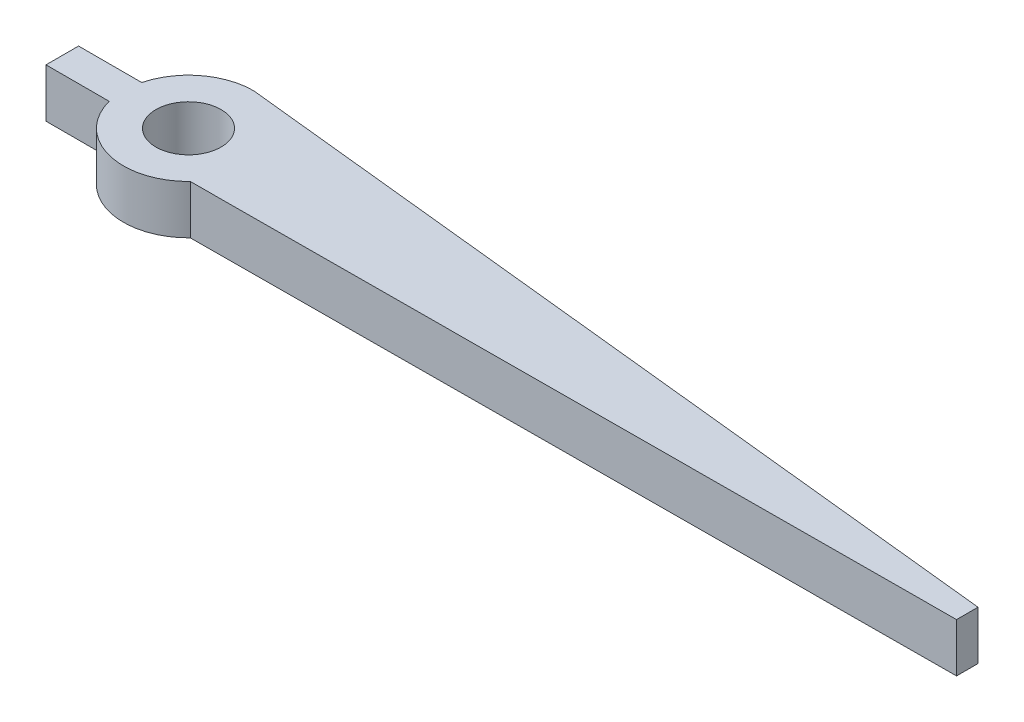
ISO-10303-21;
HEADER;
FILE_DESCRIPTION(('STEP AP214'),'2;1');
FILE_NAME('part.step','',(''),(''),'','','');
FILE_SCHEMA(('AUTOMOTIVE_DESIGN { 1 0 10303 214 1 1 1 1 }'));
ENDSEC;
DATA;
#1=APPLICATION_CONTEXT('core data for automotive mechanical design processes');
#2=APPLICATION_PROTOCOL_DEFINITION('international standard','automotive_design',2000,#1);
#3=PRODUCT_CONTEXT('',#1,'mechanical');
#4=PRODUCT('Part','Part','',(#3));
#5=PRODUCT_RELATED_PRODUCT_CATEGORY('part','',(#4));
#6=PRODUCT_DEFINITION_FORMATION('','',#4);
#7=PRODUCT_DEFINITION_CONTEXT('part definition',#1,'design');
#8=PRODUCT_DEFINITION('design','',#6,#7);
#9=PRODUCT_DEFINITION_SHAPE('','',#8);
#10=(LENGTH_UNIT() NAMED_UNIT(*) SI_UNIT(.MILLI.,.METRE.));
#11=(NAMED_UNIT(*) PLANE_ANGLE_UNIT() SI_UNIT($,.RADIAN.));
#12=(NAMED_UNIT(*) SI_UNIT($,.STERADIAN.) SOLID_ANGLE_UNIT());
#13=UNCERTAINTY_MEASURE_WITH_UNIT(LENGTH_MEASURE(1.E-05),#10,'distance_accuracy_value','');
#14=(GEOMETRIC_REPRESENTATION_CONTEXT(3) GLOBAL_UNCERTAINTY_ASSIGNED_CONTEXT((#13)) GLOBAL_UNIT_ASSIGNED_CONTEXT((#10,
#11,#12)) REPRESENTATION_CONTEXT('',''));
#15=CARTESIAN_POINT('',(0.,0.,0.));
#16=DIRECTION('',(0.,0.,1.));
#17=DIRECTION('',(1.,0.,0.));
#18=AXIS2_PLACEMENT_3D('',#15,#16,#17);
#19=CARTESIAN_POINT('',(1.39491392771798,1.5,-13.2717194905799));
#20=DIRECTION('',(0.104528463267654,0.,-0.994521895368273));
#21=DIRECTION('',(-0.994521895368273,0.,-0.104528463267654));
#22=AXIS2_PLACEMENT_3D('',#19,#20,#21);
#23=PLANE('',#22);
#24=DIRECTION('',(0.994521895368273,0.,0.104528463267654));
#25=VECTOR('',#24,1.);
#26=CARTESIAN_POINT('',(1.39491392771798,0.,-13.2717194905799));
#27=LINE('',#26,#25);
#28=CARTESIAN_POINT('',(-40.4795822764462,0.,-17.672906391254));
#29=VERTEX_POINT('',#28);
#30=CARTESIAN_POINT('',(-15.6165348922393,0.,-15.0596948095627));
#31=VERTEX_POINT('',#30);
#32=EDGE_CURVE('E146',#29,#31,#27,.T.);
#33=ORIENTED_EDGE('',*,*,#32,.F.);
#34=DIRECTION('',(0.,-1.,0.));
#35=VECTOR('',#34,1.);
#36=CARTESIAN_POINT('',(-40.4795822764462,1.5,-17.672906391254));
#37=LINE('',#36,#35);
#38=CARTESIAN_POINT('',(-40.4795822764462,1.5,-17.672906391254));
#39=VERTEX_POINT('',#38);
#40=EDGE_CURVE('E11',#39,#29,#37,.T.);
#41=ORIENTED_EDGE('',*,*,#40,.F.);
#42=DIRECTION('',(0.994521895368273,0.,0.104528463267654));
#43=VECTOR('',#42,1.);
#44=CARTESIAN_POINT('',(1.39491392771798,1.5,-13.2717194905799));
#45=LINE('',#44,#43);
#46=CARTESIAN_POINT('',(-15.6165348922393,1.5,-15.0596948095627));
#47=VERTEX_POINT('',#46);
#48=EDGE_CURVE('E174',#39,#47,#45,.T.);
#49=ORIENTED_EDGE('',*,*,#48,.T.);
#50=DIRECTION('',(0.,-1.,0.));
#51=VECTOR('',#50,1.);
#52=CARTESIAN_POINT('',(-15.6165348922393,1.5,-15.0596948095627));
#53=LINE('',#52,#51);
#54=EDGE_CURVE('E58',#47,#31,#53,.T.);
#55=ORIENTED_EDGE('',*,*,#54,.T.);
#56=EDGE_LOOP('',(#33,#41,#49,#55));
#57=FACE_BOUND('',#56,.T.);
#58=ADVANCED_FACE('F41',(#57),#23,.T.);
#59=CARTESIAN_POINT('',(-40.4795822764462,1.5,-15.672906391254));
#60=DIRECTION('',(0.,-1.,0.));
#61=DIRECTION('',(0.,0.,-1.));
#62=AXIS2_PLACEMENT_3D('',#59,#60,#61);
#63=CYLINDRICAL_SURFACE('',#62,2.);
#64=CARTESIAN_POINT('',(-40.4795822764462,0.,-15.672906391254));
#65=DIRECTION('',(0.,1.,0.));
#66=DIRECTION('',(0.,0.,1.));
#67=AXIS2_PLACEMENT_3D('',#64,#65,#66);
#68=CIRCLE('',#67,2.);
#69=CARTESIAN_POINT('',(-42.4160739495499,0.,-16.172906391254));
#70=VERTEX_POINT('',#69);
#71=EDGE_CURVE('E149',#29,#70,#68,.T.);
#72=ORIENTED_EDGE('',*,*,#71,.T.);
#73=DIRECTION('',(0.,-1.,0.));
#74=VECTOR('',#73,1.);
#75=CARTESIAN_POINT('',(-42.4160739495499,1.5,-16.172906391254));
#76=LINE('',#75,#74);
#77=CARTESIAN_POINT('',(-42.4160739495499,1.5,-16.172906391254));
#78=VERTEX_POINT('',#77);
#79=EDGE_CURVE('E50',#78,#70,#76,.T.);
#80=ORIENTED_EDGE('',*,*,#79,.F.);
#81=CARTESIAN_POINT('',(-40.4795822764462,1.5,-15.672906391254));
#82=DIRECTION('',(0.,1.,0.));
#83=DIRECTION('',(0.,0.,1.));
#84=AXIS2_PLACEMENT_3D('',#81,#82,#83);
#85=CIRCLE('',#84,2.);
#86=EDGE_CURVE('E122',#39,#78,#85,.T.);
#87=ORIENTED_EDGE('',*,*,#86,.F.);
#88=ORIENTED_EDGE('',*,*,#40,.T.);
#89=EDGE_LOOP('',(#72,#80,#87,#88));
#90=FACE_BOUND('',#89,.T.);
#91=ADVANCED_FACE('F227',(#90),#63,.T.);
#92=CARTESIAN_POINT('',(0.,1.5,-16.172906391254));
#93=DIRECTION('',(0.,0.,1.));
#94=DIRECTION('',(1.,0.,0.));
#95=AXIS2_PLACEMENT_3D('',#92,#93,#94);
#96=PLANE('',#95);
#97=DIRECTION('',(-1.,0.,0.));
#98=VECTOR('',#97,1.);
#99=CARTESIAN_POINT('',(0.,0.,-16.172906391254));
#100=LINE('',#99,#98);
#101=CARTESIAN_POINT('',(-44.3560739495499,0.,-16.172906391254));
#102=VERTEX_POINT('',#101);
#103=EDGE_CURVE('E152',#70,#102,#100,.T.);
#104=ORIENTED_EDGE('',*,*,#103,.T.);
#105=DIRECTION('',(0.,-1.,0.));
#106=VECTOR('',#105,1.);
#107=CARTESIAN_POINT('',(-44.3560739495499,1.5,-16.172906391254));
#108=LINE('',#107,#106);
#109=CARTESIAN_POINT('',(-44.3560739495499,1.5,-16.172906391254));
#110=VERTEX_POINT('',#109);
#111=EDGE_CURVE('E184',#110,#102,#108,.T.);
#112=ORIENTED_EDGE('',*,*,#111,.F.);
#113=DIRECTION('',(-1.,0.,0.));
#114=VECTOR('',#113,1.);
#115=CARTESIAN_POINT('',(0.,1.5,-16.172906391254));
#116=LINE('',#115,#114);
#117=EDGE_CURVE('E195',#78,#110,#116,.T.);
#118=ORIENTED_EDGE('',*,*,#117,.F.);
#119=ORIENTED_EDGE('',*,*,#79,.T.);
#120=EDGE_LOOP('',(#104,#112,#118,#119));
#121=FACE_BOUND('',#120,.T.);
#122=ADVANCED_FACE('F193',(#121),#96,.F.);
#123=CARTESIAN_POINT('',(-44.3560739495499,1.5,0.));
#124=DIRECTION('',(1.,0.,0.));
#125=DIRECTION('',(0.,0.,-1.));
#126=AXIS2_PLACEMENT_3D('',#123,#124,#125);
#127=PLANE('',#126);
#128=DIRECTION('',(0.,0.,1.));
#129=VECTOR('',#128,1.);
#130=CARTESIAN_POINT('',(-44.3560739495499,0.,0.));
#131=LINE('',#130,#129);
#132=CARTESIAN_POINT('',(-44.3560739495499,0.,-15.172906391254));
#133=VERTEX_POINT('',#132);
#134=EDGE_CURVE('E155',#102,#133,#131,.T.);
#135=ORIENTED_EDGE('',*,*,#134,.T.);
#136=DIRECTION('',(0.,-1.,0.));
#137=VECTOR('',#136,1.);
#138=CARTESIAN_POINT('',(-44.3560739495499,1.5,-15.172906391254));
#139=LINE('',#138,#137);
#140=CARTESIAN_POINT('',(-44.3560739495499,1.5,-15.172906391254));
#141=VERTEX_POINT('',#140);
#142=EDGE_CURVE('E181',#141,#133,#139,.T.);
#143=ORIENTED_EDGE('',*,*,#142,.F.);
#144=DIRECTION('',(0.,0.,1.));
#145=VECTOR('',#144,1.);
#146=CARTESIAN_POINT('',(-44.3560739495499,1.5,0.));
#147=LINE('',#146,#145);
#148=EDGE_CURVE('E207',#110,#141,#147,.T.);
#149=ORIENTED_EDGE('',*,*,#148,.F.);
#150=ORIENTED_EDGE('',*,*,#111,.T.);
#151=EDGE_LOOP('',(#135,#143,#149,#150));
#152=FACE_BOUND('',#151,.T.);
#153=ADVANCED_FACE('F205',(#152),#127,.F.);
#154=CARTESIAN_POINT('',(0.,1.5,-15.172906391254));
#155=DIRECTION('',(0.,0.,1.));
#156=DIRECTION('',(1.,0.,0.));
#157=AXIS2_PLACEMENT_3D('',#154,#155,#156);
#158=PLANE('',#157);
#159=DIRECTION('',(-1.,0.,0.));
#160=VECTOR('',#159,1.);
#161=CARTESIAN_POINT('',(0.,0.,-15.172906391254));
#162=LINE('',#161,#160);
#163=CARTESIAN_POINT('',(-42.4160739495499,0.,-15.172906391254));
#164=VERTEX_POINT('',#163);
#165=EDGE_CURVE('E159',#164,#133,#162,.T.);
#166=ORIENTED_EDGE('',*,*,#165,.F.);
#167=DIRECTION('',(0.,-1.,0.));
#168=VECTOR('',#167,1.);
#169=CARTESIAN_POINT('',(-42.4160739495499,1.5,-15.172906391254));
#170=LINE('',#169,#168);
#171=CARTESIAN_POINT('',(-42.4160739495499,1.5,-15.172906391254));
#172=VERTEX_POINT('',#171);
#173=EDGE_CURVE('E131',#172,#164,#170,.T.);
#174=ORIENTED_EDGE('',*,*,#173,.F.);
#175=DIRECTION('',(-1.,0.,0.));
#176=VECTOR('',#175,1.);
#177=CARTESIAN_POINT('',(0.,1.5,-15.172906391254));
#178=LINE('',#177,#176);
#179=EDGE_CURVE('E118',#172,#141,#178,.T.);
#180=ORIENTED_EDGE('',*,*,#179,.T.);
#181=ORIENTED_EDGE('',*,*,#142,.T.);
#182=EDGE_LOOP('',(#166,#174,#180,#181));
#183=FACE_BOUND('',#182,.T.);
#184=ADVANCED_FACE('F237',(#183),#158,.T.);
#185=CARTESIAN_POINT('',(-39.0384701068818,0.,-14.2861130704115));
#186=VERTEX_POINT('',#185);
#187=EDGE_CURVE('E127',#164,#186,#68,.T.);
#188=ORIENTED_EDGE('',*,*,#187,.T.);
#189=DIRECTION('',(0.,-1.,0.));
#190=VECTOR('',#189,1.);
#191=CARTESIAN_POINT('',(-39.0384701068818,1.5,-14.2861130704115));
#192=LINE('',#191,#190);
#193=CARTESIAN_POINT('',(-39.0384701068818,1.5,-14.2861130704115));
#194=VERTEX_POINT('',#193);
#195=EDGE_CURVE('E124',#194,#186,#192,.T.);
#196=ORIENTED_EDGE('',*,*,#195,.F.);
#197=EDGE_CURVE('E109',#172,#194,#85,.T.);
#198=ORIENTED_EDGE('',*,*,#197,.F.);
#199=ORIENTED_EDGE('',*,*,#173,.T.);
#200=EDGE_LOOP('',(#188,#196,#198,#199));
#201=FACE_BOUND('',#200,.T.);
#202=ADVANCED_FACE('F125',(#201),#63,.T.);
#203=CARTESIAN_POINT('',(-0.070815266710384,1.5,-14.4767296623454));
#204=DIRECTION('',(-0.00489160336145005,0.,-0.999988036036709));
#205=DIRECTION('',(-0.999988036036709,0.,0.00489160336145005));
#206=AXIS2_PLACEMENT_3D('',#203,#204,#205);
#207=PLANE('',#206);
#208=DIRECTION('',(0.999988036036709,0.,-0.00489160336145005));
#209=VECTOR('',#208,1.);
#210=CARTESIAN_POINT('',(-0.070815266710384,0.,-14.4767296623454));
#211=LINE('',#210,#209);
#212=CARTESIAN_POINT('',(-15.6165348922393,0.,-14.4006852581766));
#213=VERTEX_POINT('',#212);
#214=EDGE_CURVE('E163',#186,#213,#211,.T.);
#215=ORIENTED_EDGE('',*,*,#214,.T.);
#216=DIRECTION('',(0.,-1.,0.));
#217=VECTOR('',#216,1.);
#218=CARTESIAN_POINT('',(-15.6165348922393,1.5,-14.4006852581766));
#219=LINE('',#218,#217);
#220=CARTESIAN_POINT('',(-15.6165348922393,1.5,-14.4006852581766));
#221=VERTEX_POINT('',#220);
#222=EDGE_CURVE('E84',#221,#213,#219,.T.);
#223=ORIENTED_EDGE('',*,*,#222,.F.);
#224=DIRECTION('',(0.999988036036709,0.,-0.00489160336145005));
#225=VECTOR('',#224,1.);
#226=CARTESIAN_POINT('',(-0.070815266710384,1.5,-14.4767296623454));
#227=LINE('',#226,#225);
#228=EDGE_CURVE('E116',#194,#221,#227,.T.);
#229=ORIENTED_EDGE('',*,*,#228,.F.);
#230=ORIENTED_EDGE('',*,*,#195,.T.);
#231=EDGE_LOOP('',(#215,#223,#229,#230));
#232=FACE_BOUND('',#231,.T.);
#233=ADVANCED_FACE('F133',(#232),#207,.F.);
#234=CARTESIAN_POINT('',(-15.6165348922393,1.5,0.));
#235=DIRECTION('',(1.,0.,0.));
#236=DIRECTION('',(0.,0.,-1.));
#237=AXIS2_PLACEMENT_3D('',#234,#235,#236);
#238=PLANE('',#237);
#239=DIRECTION('',(0.,0.,1.));
#240=VECTOR('',#239,1.);
#241=CARTESIAN_POINT('',(-15.6165348922393,0.,0.));
#242=LINE('',#241,#240);
#243=EDGE_CURVE('E166',#31,#213,#242,.T.);
#244=ORIENTED_EDGE('',*,*,#243,.F.);
#245=ORIENTED_EDGE('',*,*,#54,.F.);
#246=DIRECTION('',(0.,0.,1.));
#247=VECTOR('',#246,1.);
#248=CARTESIAN_POINT('',(-15.6165348922393,1.5,0.));
#249=LINE('',#248,#247);
#250=EDGE_CURVE('E135',#47,#221,#249,.T.);
#251=ORIENTED_EDGE('',*,*,#250,.T.);
#252=ORIENTED_EDGE('',*,*,#222,.T.);
#253=EDGE_LOOP('',(#244,#245,#251,#252));
#254=FACE_BOUND('',#253,.T.);
#255=ADVANCED_FACE('F215',(#254),#238,.T.);
#256=CARTESIAN_POINT('',(-40.4795822764462,1.5,-15.672906391254));
#257=DIRECTION('',(0.,-1.,0.));
#258=DIRECTION('',(0.,0.,-1.));
#259=AXIS2_PLACEMENT_3D('',#256,#257,#258);
#260=CYLINDRICAL_SURFACE('',#259,0.999999999999998);
#261=CARTESIAN_POINT('',(-40.4795822764462,1.5,-15.672906391254));
#262=DIRECTION('',(0.,1.,0.));
#263=DIRECTION('',(0.,0.,1.));
#264=AXIS2_PLACEMENT_3D('',#261,#262,#263);
#265=CIRCLE('',#264,0.999999999999998);
#266=CARTESIAN_POINT('',(-40.4795822764462,1.5,-14.672906391254));
#267=VERTEX_POINT('',#266);
#268=EDGE_CURVE('E138',#267,#267,#265,.T.);
#269=ORIENTED_EDGE('',*,*,#268,.T.);
#270=EDGE_LOOP('',(#269));
#271=FACE_BOUND('',#270,.T.);
#272=CARTESIAN_POINT('',(-40.4795822764462,0.,-15.672906391254));
#273=DIRECTION('',(0.,1.,0.));
#274=DIRECTION('',(0.,0.,1.));
#275=AXIS2_PLACEMENT_3D('',#272,#273,#274);
#276=CIRCLE('',#275,0.999999999999998);
#277=CARTESIAN_POINT('',(-40.4795822764462,0.,-14.672906391254));
#278=VERTEX_POINT('',#277);
#279=EDGE_CURVE('E170',#278,#278,#276,.T.);
#280=ORIENTED_EDGE('',*,*,#279,.F.);
#281=EDGE_LOOP('',(#280));
#282=FACE_BOUND('',#281,.T.);
#283=ADVANCED_FACE('F217',(#271,#282),#260,.F.);
#284=CARTESIAN_POINT('',(0.,1.5,0.));
#285=DIRECTION('',(0.,1.,0.));
#286=DIRECTION('',(0.,0.,1.));
#287=AXIS2_PLACEMENT_3D('',#284,#285,#286);
#288=PLANE('',#287);
#289=ORIENTED_EDGE('',*,*,#48,.F.);
#290=ORIENTED_EDGE('',*,*,#86,.T.);
#291=ORIENTED_EDGE('',*,*,#117,.T.);
#292=ORIENTED_EDGE('',*,*,#148,.T.);
#293=ORIENTED_EDGE('',*,*,#179,.F.);
#294=ORIENTED_EDGE('',*,*,#197,.T.);
#295=ORIENTED_EDGE('',*,*,#228,.T.);
#296=ORIENTED_EDGE('',*,*,#250,.F.);
#297=EDGE_LOOP('',(#289,#290,#291,#292,#293,#294,#295,#296));
#298=FACE_BOUND('',#297,.T.);
#299=ORIENTED_EDGE('',*,*,#268,.F.);
#300=EDGE_LOOP('',(#299));
#301=FACE_BOUND('',#300,.T.);
#302=ADVANCED_FACE('F112',(#298,#301),#288,.T.);
#303=CARTESIAN_POINT('',(0.,0.,0.));
#304=DIRECTION('',(0.,1.,0.));
#305=DIRECTION('',(0.,0.,1.));
#306=AXIS2_PLACEMENT_3D('',#303,#304,#305);
#307=PLANE('',#306);
#308=ORIENTED_EDGE('',*,*,#32,.T.);
#309=ORIENTED_EDGE('',*,*,#243,.T.);
#310=ORIENTED_EDGE('',*,*,#214,.F.);
#311=ORIENTED_EDGE('',*,*,#187,.F.);
#312=ORIENTED_EDGE('',*,*,#165,.T.);
#313=ORIENTED_EDGE('',*,*,#134,.F.);
#314=ORIENTED_EDGE('',*,*,#103,.F.);
#315=ORIENTED_EDGE('',*,*,#71,.F.);
#316=EDGE_LOOP('',(#308,#309,#310,#311,#312,#313,#314,#315));
#317=FACE_BOUND('',#316,.T.);
#318=ORIENTED_EDGE('',*,*,#279,.T.);
#319=EDGE_LOOP('',(#318));
#320=FACE_BOUND('',#319,.T.);
#321=ADVANCED_FACE('F200',(#317,#320),#307,.F.);
#322=CLOSED_SHELL('',(#58,#91,#122,#153,#184,#202,#233,#255,#283,#302,#321));
#323=MANIFOLD_SOLID_BREP('B2',#322);
#324=ADVANCED_BREP_SHAPE_REPRESENTATION('',(#18,#323),#14);
#325=SHAPE_DEFINITION_REPRESENTATION(#9,#324);
ENDSEC;
END-ISO-10303-21;
